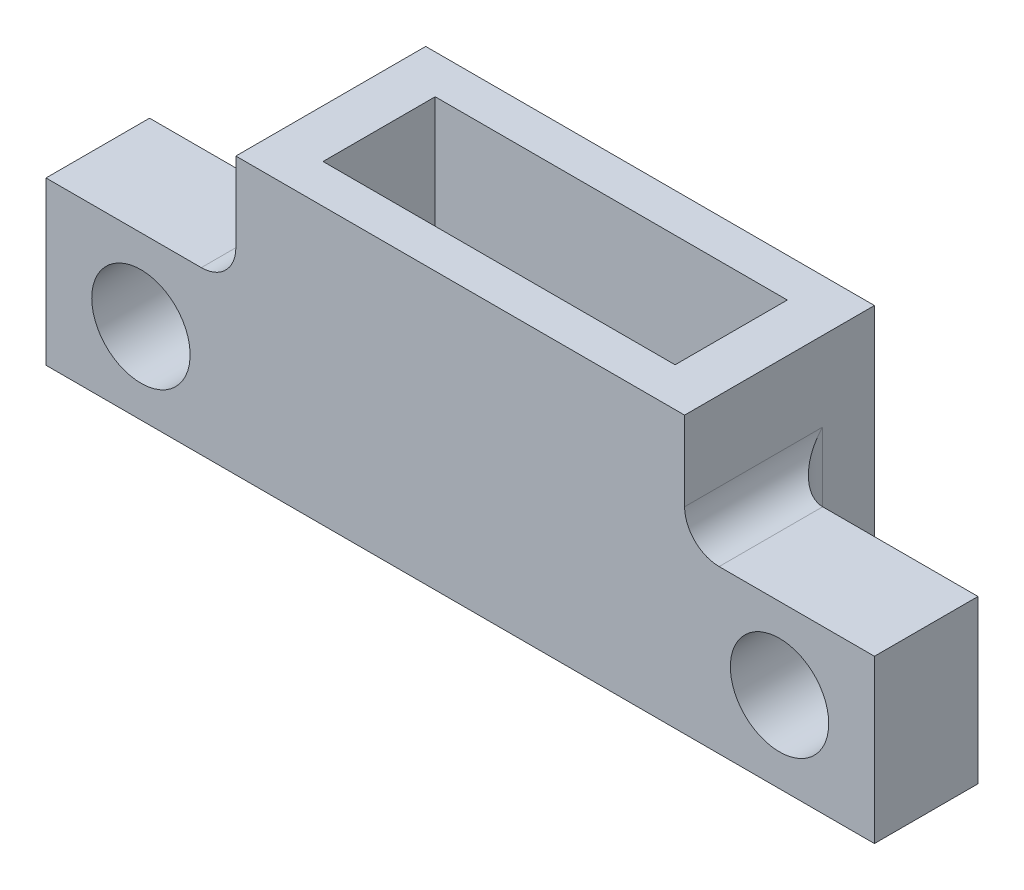
ISO-10303-21;
HEADER;
FILE_DESCRIPTION(('STEP AP214'),'2;1');
FILE_NAME('part.step','',(''),(''),'','','');
FILE_SCHEMA(('AUTOMOTIVE_DESIGN { 1 0 10303 214 1 1 1 1 }'));
ENDSEC;
DATA;
#1=APPLICATION_CONTEXT('core data for automotive mechanical design processes');
#2=APPLICATION_PROTOCOL_DEFINITION('international standard','automotive_design',2000,#1);
#3=PRODUCT_CONTEXT('',#1,'mechanical');
#4=PRODUCT('Part','Part','',(#3));
#5=PRODUCT_RELATED_PRODUCT_CATEGORY('part','',(#4));
#6=PRODUCT_DEFINITION_FORMATION('','',#4);
#7=PRODUCT_DEFINITION_CONTEXT('part definition',#1,'design');
#8=PRODUCT_DEFINITION('design','',#6,#7);
#9=PRODUCT_DEFINITION_SHAPE('','',#8);
#10=(LENGTH_UNIT() NAMED_UNIT(*) SI_UNIT(.MILLI.,.METRE.));
#11=(NAMED_UNIT(*) PLANE_ANGLE_UNIT() SI_UNIT($,.RADIAN.));
#12=(NAMED_UNIT(*) SI_UNIT($,.STERADIAN.) SOLID_ANGLE_UNIT());
#13=UNCERTAINTY_MEASURE_WITH_UNIT(LENGTH_MEASURE(1.E-05),#10,'distance_accuracy_value','');
#14=(GEOMETRIC_REPRESENTATION_CONTEXT(3) GLOBAL_UNCERTAINTY_ASSIGNED_CONTEXT((#13)) GLOBAL_UNIT_ASSIGNED_CONTEXT((#10,
#11,#12)) REPRESENTATION_CONTEXT('',''));
#15=CARTESIAN_POINT('',(0.,0.,0.));
#16=DIRECTION('',(0.,0.,1.));
#17=DIRECTION('',(1.,0.,0.));
#18=AXIS2_PLACEMENT_3D('',#15,#16,#17);
#19=CARTESIAN_POINT('',(13.,10.,5.5));
#20=DIRECTION('',(-1.,0.,0.));
#21=DIRECTION('',(0.,0.,1.));
#22=AXIS2_PLACEMENT_3D('',#19,#20,#21);
#23=PLANE('',#22);
#24=DIRECTION('',(0.,-1.,0.));
#25=VECTOR('',#24,1.);
#26=CARTESIAN_POINT('',(13.,10.,5.5));
#27=LINE('',#26,#25);
#28=CARTESIAN_POINT('',(13.,10.,5.5));
#29=VERTEX_POINT('',#28);
#30=CARTESIAN_POINT('',(13.,5.4,5.5));
#31=VERTEX_POINT('',#30);
#32=EDGE_CURVE('E427',#29,#31,#27,.T.);
#33=ORIENTED_EDGE('',*,*,#32,.T.);
#34=DIRECTION('',(0.,0.,1.));
#35=VECTOR('',#34,1.);
#36=CARTESIAN_POINT('',(13.,5.4,5.5));
#37=LINE('',#36,#35);
#38=CARTESIAN_POINT('',(13.,5.4,-2.5));
#39=VERTEX_POINT('',#38);
#40=EDGE_CURVE('E60',#31,#39,#37,.F.);
#41=ORIENTED_EDGE('',*,*,#40,.T.);
#42=DIRECTION('',(0.,-1.,0.));
#43=VECTOR('',#42,1.);
#44=CARTESIAN_POINT('',(13.,10.,-2.5));
#45=LINE('',#44,#43);
#46=CARTESIAN_POINT('',(13.,-6.,-2.5));
#47=VERTEX_POINT('',#46);
#48=EDGE_CURVE('E448',#39,#47,#45,.T.);
#49=ORIENTED_EDGE('',*,*,#48,.T.);
#50=DIRECTION('',(0.,0.,1.));
#51=VECTOR('',#50,1.);
#52=CARTESIAN_POINT('',(13.,-6.,5.5));
#53=LINE('',#52,#51);
#54=CARTESIAN_POINT('',(13.,-6.,-5.5));
#55=VERTEX_POINT('',#54);
#56=EDGE_CURVE('E242',#55,#47,#53,.T.);
#57=ORIENTED_EDGE('',*,*,#56,.F.);
#58=DIRECTION('',(0.,-1.,0.));
#59=VECTOR('',#58,1.);
#60=CARTESIAN_POINT('',(13.,10.,-5.5));
#61=LINE('',#60,#59);
#62=CARTESIAN_POINT('',(13.,10.,-5.5));
#63=VERTEX_POINT('',#62);
#64=EDGE_CURVE('E434',#63,#55,#61,.T.);
#65=ORIENTED_EDGE('',*,*,#64,.F.);
#66=DIRECTION('',(0.,0.,-1.));
#67=VECTOR('',#66,1.);
#68=CARTESIAN_POINT('',(13.,10.,5.5));
#69=LINE('',#68,#67);
#70=EDGE_CURVE('E418',#29,#63,#69,.T.);
#71=ORIENTED_EDGE('',*,*,#70,.F.);
#72=EDGE_LOOP('',(#33,#41,#49,#57,#65,#71));
#73=FACE_BOUND('',#72,.T.);
#74=ADVANCED_FACE('F37',(#73),#23,.F.);
#75=CARTESIAN_POINT('',(0.,10.,0.));
#76=DIRECTION('',(0.,-1.,0.));
#77=DIRECTION('',(0.,0.,-1.));
#78=AXIS2_PLACEMENT_3D('',#75,#76,#77);
#79=PLANE('',#78);
#80=ORIENTED_EDGE('',*,*,#70,.T.);
#81=DIRECTION('',(-1.,0.,0.));
#82=VECTOR('',#81,1.);
#83=CARTESIAN_POINT('',(-13.,10.,-5.5));
#84=LINE('',#83,#82);
#85=CARTESIAN_POINT('',(-13.,10.,-5.5));
#86=VERTEX_POINT('',#85);
#87=EDGE_CURVE('E421',#63,#86,#84,.T.);
#88=ORIENTED_EDGE('',*,*,#87,.T.);
#89=DIRECTION('',(0.,0.,1.));
#90=VECTOR('',#89,1.);
#91=CARTESIAN_POINT('',(-13.,10.,5.5));
#92=LINE('',#91,#90);
#93=CARTESIAN_POINT('',(-13.,10.,5.5));
#94=VERTEX_POINT('',#93);
#95=EDGE_CURVE('E423',#86,#94,#92,.T.);
#96=ORIENTED_EDGE('',*,*,#95,.T.);
#97=DIRECTION('',(1.,0.,0.));
#98=VECTOR('',#97,1.);
#99=CARTESIAN_POINT('',(-13.,10.,5.5));
#100=LINE('',#99,#98);
#101=EDGE_CURVE('E425',#94,#29,#100,.T.);
#102=ORIENTED_EDGE('',*,*,#101,.T.);
#103=EDGE_LOOP('',(#80,#88,#96,#102));
#104=FACE_BOUND('',#103,.T.);
#105=DIRECTION('',(0.,0.,-1.));
#106=VECTOR('',#105,1.);
#107=CARTESIAN_POINT('',(10.2,10.,3.25));
#108=LINE('',#107,#106);
#109=CARTESIAN_POINT('',(10.2,10.,3.25));
#110=VERTEX_POINT('',#109);
#111=CARTESIAN_POINT('',(10.2,10.,-3.25));
#112=VERTEX_POINT('',#111);
#113=EDGE_CURVE('E385',#110,#112,#108,.T.);
#114=ORIENTED_EDGE('',*,*,#113,.F.);
#115=DIRECTION('',(1.,0.,0.));
#116=VECTOR('',#115,1.);
#117=CARTESIAN_POINT('',(-10.2,10.,3.25));
#118=LINE('',#117,#116);
#119=CARTESIAN_POINT('',(-10.2,10.,3.25));
#120=VERTEX_POINT('',#119);
#121=EDGE_CURVE('E393',#120,#110,#118,.T.);
#122=ORIENTED_EDGE('',*,*,#121,.F.);
#123=DIRECTION('',(0.,0.,1.));
#124=VECTOR('',#123,1.);
#125=CARTESIAN_POINT('',(-10.2,10.,3.25));
#126=LINE('',#125,#124);
#127=CARTESIAN_POINT('',(-10.2,10.,-3.25));
#128=VERTEX_POINT('',#127);
#129=EDGE_CURVE('E390',#128,#120,#126,.T.);
#130=ORIENTED_EDGE('',*,*,#129,.F.);
#131=DIRECTION('',(-1.,0.,0.));
#132=VECTOR('',#131,1.);
#133=CARTESIAN_POINT('',(-10.2,10.,-3.25));
#134=LINE('',#133,#132);
#135=EDGE_CURVE('E387',#112,#128,#134,.T.);
#136=ORIENTED_EDGE('',*,*,#135,.F.);
#137=EDGE_LOOP('',(#114,#122,#130,#136));
#138=FACE_BOUND('',#137,.T.);
#139=ADVANCED_FACE('F480',(#104,#138),#79,.F.);
#140=CARTESIAN_POINT('',(-13.,10.,-5.5));
#141=DIRECTION('',(0.,0.,1.));
#142=DIRECTION('',(1.,0.,0.));
#143=AXIS2_PLACEMENT_3D('',#140,#141,#142);
#144=PLANE('',#143);
#145=ORIENTED_EDGE('',*,*,#64,.T.);
#146=DIRECTION('',(1.,0.,0.));
#147=VECTOR('',#146,1.);
#148=CARTESIAN_POINT('',(-13.,-6.,-5.5));
#149=LINE('',#148,#147);
#150=CARTESIAN_POINT('',(-13.,-6.,-5.5));
#151=VERTEX_POINT('',#150);
#152=EDGE_CURVE('E381',#151,#55,#149,.T.);
#153=ORIENTED_EDGE('',*,*,#152,.F.);
#154=DIRECTION('',(0.,-1.,0.));
#155=VECTOR('',#154,1.);
#156=CARTESIAN_POINT('',(-13.,10.,-5.5));
#157=LINE('',#156,#155);
#158=EDGE_CURVE('E431',#86,#151,#157,.T.);
#159=ORIENTED_EDGE('',*,*,#158,.F.);
#160=ORIENTED_EDGE('',*,*,#87,.F.);
#161=EDGE_LOOP('',(#145,#153,#159,#160));
#162=FACE_BOUND('',#161,.T.);
#163=ADVANCED_FACE('F475',(#162),#144,.F.);
#164=CARTESIAN_POINT('',(-13.,10.,5.5));
#165=DIRECTION('',(1.,0.,0.));
#166=DIRECTION('',(0.,0.,-1.));
#167=AXIS2_PLACEMENT_3D('',#164,#165,#166);
#168=PLANE('',#167);
#169=DIRECTION('',(0.,1.,0.));
#170=VECTOR('',#169,1.);
#171=CARTESIAN_POINT('',(-13.,3.4,-2.5));
#172=LINE('',#171,#170);
#173=CARTESIAN_POINT('',(-13.,-6.,-2.5));
#174=VERTEX_POINT('',#173);
#175=CARTESIAN_POINT('',(-13.,5.4,-2.5));
#176=VERTEX_POINT('',#175);
#177=EDGE_CURVE('E436',#174,#176,#172,.T.);
#178=ORIENTED_EDGE('',*,*,#177,.T.);
#179=DIRECTION('',(0.,0.,1.));
#180=VECTOR('',#179,1.);
#181=CARTESIAN_POINT('',(-13.,5.4,5.5));
#182=LINE('',#181,#180);
#183=CARTESIAN_POINT('',(-13.,5.4,5.5));
#184=VERTEX_POINT('',#183);
#185=EDGE_CURVE('E438',#176,#184,#182,.T.);
#186=ORIENTED_EDGE('',*,*,#185,.T.);
#187=DIRECTION('',(0.,-1.,0.));
#188=VECTOR('',#187,1.);
#189=CARTESIAN_POINT('',(-13.,10.,5.5));
#190=LINE('',#189,#188);
#191=EDGE_CURVE('E429',#94,#184,#190,.T.);
#192=ORIENTED_EDGE('',*,*,#191,.F.);
#193=ORIENTED_EDGE('',*,*,#95,.F.);
#194=ORIENTED_EDGE('',*,*,#158,.T.);
#195=DIRECTION('',(0.,0.,-1.));
#196=VECTOR('',#195,1.);
#197=CARTESIAN_POINT('',(-13.,-6.,5.5));
#198=LINE('',#197,#196);
#199=EDGE_CURVE('E379',#174,#151,#198,.T.);
#200=ORIENTED_EDGE('',*,*,#199,.F.);
#201=EDGE_LOOP('',(#178,#186,#192,#193,#194,#200));
#202=FACE_BOUND('',#201,.T.);
#203=ADVANCED_FACE('F607',(#202),#168,.F.);
#204=CARTESIAN_POINT('',(-13.,10.,5.5));
#205=DIRECTION('',(0.,0.,-1.));
#206=DIRECTION('',(-1.,0.,0.));
#207=AXIS2_PLACEMENT_3D('',#204,#205,#206);
#208=PLANE('',#207);
#209=ORIENTED_EDGE('',*,*,#191,.T.);
#210=CARTESIAN_POINT('',(-15.,5.4,5.5));
#211=DIRECTION('',(0.,0.,-1.));
#212=DIRECTION('',(-1.,0.,0.));
#213=AXIS2_PLACEMENT_3D('',#210,#211,#212);
#214=CIRCLE('',#213,2.);
#215=CARTESIAN_POINT('',(-15.,3.4,5.5));
#216=VERTEX_POINT('',#215);
#217=EDGE_CURVE('E453',#184,#216,#214,.T.);
#218=ORIENTED_EDGE('',*,*,#217,.T.);
#219=DIRECTION('',(-1.,0.,0.));
#220=VECTOR('',#219,1.);
#221=CARTESIAN_POINT('',(-13.,3.4,5.5));
#222=LINE('',#221,#220);
#223=CARTESIAN_POINT('',(-24.,3.4,5.5));
#224=VERTEX_POINT('',#223);
#225=EDGE_CURVE('E259',#216,#224,#222,.T.);
#226=ORIENTED_EDGE('',*,*,#225,.T.);
#227=DIRECTION('',(0.,-1.,0.));
#228=VECTOR('',#227,1.);
#229=CARTESIAN_POINT('',(-24.,-6.,5.5));
#230=LINE('',#229,#228);
#231=CARTESIAN_POINT('',(-24.,-6.,5.5));
#232=VERTEX_POINT('',#231);
#233=EDGE_CURVE('E248',#224,#232,#230,.T.);
#234=ORIENTED_EDGE('',*,*,#233,.T.);
#235=DIRECTION('',(-1.,0.,0.));
#236=VECTOR('',#235,1.);
#237=CARTESIAN_POINT('',(-13.,-6.,5.5));
#238=LINE('',#237,#236);
#239=CARTESIAN_POINT('',(24.,-6.,5.5));
#240=VERTEX_POINT('',#239);
#241=EDGE_CURVE('E228',#240,#232,#238,.T.);
#242=ORIENTED_EDGE('',*,*,#241,.F.);
#243=DIRECTION('',(0.,1.,0.));
#244=VECTOR('',#243,1.);
#245=CARTESIAN_POINT('',(24.,-6.,5.5));
#246=LINE('',#245,#244);
#247=CARTESIAN_POINT('',(24.,3.4,5.5));
#248=VERTEX_POINT('',#247);
#249=EDGE_CURVE('E280',#240,#248,#246,.T.);
#250=ORIENTED_EDGE('',*,*,#249,.T.);
#251=DIRECTION('',(-1.,0.,0.));
#252=VECTOR('',#251,1.);
#253=CARTESIAN_POINT('',(13.,3.4,5.5));
#254=LINE('',#253,#252);
#255=CARTESIAN_POINT('',(15.,3.4,5.5));
#256=VERTEX_POINT('',#255);
#257=EDGE_CURVE('E286',#248,#256,#254,.T.);
#258=ORIENTED_EDGE('',*,*,#257,.T.);
#259=CARTESIAN_POINT('',(15.,5.4,5.5));
#260=DIRECTION('',(0.,0.,-1.));
#261=DIRECTION('',(-1.,0.,0.));
#262=AXIS2_PLACEMENT_3D('',#259,#260,#261);
#263=CIRCLE('',#262,2.);
#264=EDGE_CURVE('E46',#256,#31,#263,.T.);
#265=ORIENTED_EDGE('',*,*,#264,.T.);
#266=ORIENTED_EDGE('',*,*,#32,.F.);
#267=ORIENTED_EDGE('',*,*,#101,.F.);
#268=EDGE_LOOP('',(#209,#218,#226,#234,#242,#250,#258,#265,#266,#267));
#269=FACE_BOUND('',#268,.T.);
#270=CARTESIAN_POINT('',(18.5,-1.3,5.5));
#271=DIRECTION('',(0.,0.,1.));
#272=DIRECTION('',(1.,0.,0.));
#273=AXIS2_PLACEMENT_3D('',#270,#271,#272);
#274=CIRCLE('',#273,2.85);
#275=CARTESIAN_POINT('',(21.35,-1.3,5.5));
#276=VERTEX_POINT('',#275);
#277=EDGE_CURVE('E274',#276,#276,#274,.T.);
#278=ORIENTED_EDGE('',*,*,#277,.F.);
#279=EDGE_LOOP('',(#278));
#280=FACE_BOUND('',#279,.T.);
#281=CARTESIAN_POINT('',(-18.5,-1.3,5.5));
#282=DIRECTION('',(0.,0.,1.));
#283=DIRECTION('',(-1.,0.,0.));
#284=AXIS2_PLACEMENT_3D('',#281,#282,#283);
#285=CIRCLE('',#284,2.85);
#286=CARTESIAN_POINT('',(-21.35,-1.3,5.5));
#287=VERTEX_POINT('',#286);
#288=EDGE_CURVE('E271',#287,#287,#285,.T.);
#289=ORIENTED_EDGE('',*,*,#288,.F.);
#290=EDGE_LOOP('',(#289));
#291=FACE_BOUND('',#290,.T.);
#292=ADVANCED_FACE('F256',(#269,#280,#291),#208,.F.);
#293=CARTESIAN_POINT('',(10.2,10.,3.25));
#294=DIRECTION('',(-1.,0.,0.));
#295=DIRECTION('',(0.,0.,1.));
#296=AXIS2_PLACEMENT_3D('',#293,#294,#295);
#297=PLANE('',#296);
#298=DIRECTION('',(0.,0.,-1.));
#299=VECTOR('',#298,1.);
#300=CARTESIAN_POINT('',(10.2,0.,3.25));
#301=LINE('',#300,#299);
#302=CARTESIAN_POINT('',(10.2,0.,3.25));
#303=VERTEX_POINT('',#302);
#304=CARTESIAN_POINT('',(10.2,0.,-3.25));
#305=VERTEX_POINT('',#304);
#306=EDGE_CURVE('E241',#303,#305,#301,.T.);
#307=ORIENTED_EDGE('',*,*,#306,.F.);
#308=DIRECTION('',(0.,-1.,0.));
#309=VECTOR('',#308,1.);
#310=CARTESIAN_POINT('',(10.2,10.,3.25));
#311=LINE('',#310,#309);
#312=EDGE_CURVE('E395',#110,#303,#311,.T.);
#313=ORIENTED_EDGE('',*,*,#312,.F.);
#314=ORIENTED_EDGE('',*,*,#113,.T.);
#315=DIRECTION('',(0.,-1.,0.));
#316=VECTOR('',#315,1.);
#317=CARTESIAN_POINT('',(10.2,10.,-3.25));
#318=LINE('',#317,#316);
#319=EDGE_CURVE('E415',#112,#305,#318,.T.);
#320=ORIENTED_EDGE('',*,*,#319,.T.);
#321=EDGE_LOOP('',(#307,#313,#314,#320));
#322=FACE_BOUND('',#321,.T.);
#323=ADVANCED_FACE('F606',(#322),#297,.T.);
#324=CARTESIAN_POINT('',(-10.2,10.,-3.25));
#325=DIRECTION('',(0.,0.,1.));
#326=DIRECTION('',(1.,0.,0.));
#327=AXIS2_PLACEMENT_3D('',#324,#325,#326);
#328=PLANE('',#327);
#329=DIRECTION('',(-1.,0.,0.));
#330=VECTOR('',#329,1.);
#331=CARTESIAN_POINT('',(-10.2,0.,-3.25));
#332=LINE('',#331,#330);
#333=CARTESIAN_POINT('',(8.7,0.,-3.25));
#334=VERTEX_POINT('',#333);
#335=EDGE_CURVE('E399',#305,#334,#332,.T.);
#336=ORIENTED_EDGE('',*,*,#335,.F.);
#337=ORIENTED_EDGE('',*,*,#319,.F.);
#338=ORIENTED_EDGE('',*,*,#135,.T.);
#339=DIRECTION('',(0.,-1.,0.));
#340=VECTOR('',#339,1.);
#341=CARTESIAN_POINT('',(-10.2,10.,-3.25));
#342=LINE('',#341,#340);
#343=CARTESIAN_POINT('',(-10.2,0.,-3.25));
#344=VERTEX_POINT('',#343);
#345=EDGE_CURVE('E413',#128,#344,#342,.T.);
#346=ORIENTED_EDGE('',*,*,#345,.T.);
#347=CARTESIAN_POINT('',(-8.7,0.,-3.25));
#348=VERTEX_POINT('',#347);
#349=EDGE_CURVE('E398',#348,#344,#332,.T.);
#350=ORIENTED_EDGE('',*,*,#349,.F.);
#351=DIRECTION('',(0.,1.,0.));
#352=VECTOR('',#351,1.);
#353=CARTESIAN_POINT('',(-8.7,-6.,-3.25));
#354=LINE('',#353,#352);
#355=CARTESIAN_POINT('',(-8.7,-6.,-3.25));
#356=VERTEX_POINT('',#355);
#357=EDGE_CURVE('E376',#356,#348,#354,.T.);
#358=ORIENTED_EDGE('',*,*,#357,.F.);
#359=DIRECTION('',(1.,0.,0.));
#360=VECTOR('',#359,1.);
#361=CARTESIAN_POINT('',(-8.7,-6.,-3.25));
#362=LINE('',#361,#360);
#363=CARTESIAN_POINT('',(-6.2,-6.,-3.25));
#364=VERTEX_POINT('',#363);
#365=EDGE_CURVE('E355',#356,#364,#362,.T.);
#366=ORIENTED_EDGE('',*,*,#365,.T.);
#367=DIRECTION('',(0.,1.,0.));
#368=VECTOR('',#367,1.);
#369=CARTESIAN_POINT('',(-6.2,-6.,-3.25));
#370=LINE('',#369,#368);
#371=CARTESIAN_POINT('',(-6.2,0.,-3.25));
#372=VERTEX_POINT('',#371);
#373=EDGE_CURVE('E373',#364,#372,#370,.T.);
#374=ORIENTED_EDGE('',*,*,#373,.T.);
#375=CARTESIAN_POINT('',(-1.5,0.,-3.25));
#376=VERTEX_POINT('',#375);
#377=EDGE_CURVE('E909',#376,#372,#332,.T.);
#378=ORIENTED_EDGE('',*,*,#377,.F.);
#379=DIRECTION('',(0.,1.,0.));
#380=VECTOR('',#379,1.);
#381=CARTESIAN_POINT('',(-1.5,-6.,-3.25));
#382=LINE('',#381,#380);
#383=CARTESIAN_POINT('',(-1.5,-6.,-3.25));
#384=VERTEX_POINT('',#383);
#385=EDGE_CURVE('E349',#384,#376,#382,.T.);
#386=ORIENTED_EDGE('',*,*,#385,.F.);
#387=DIRECTION('',(1.,0.,0.));
#388=VECTOR('',#387,1.);
#389=CARTESIAN_POINT('',(-1.5,-6.,-3.25));
#390=LINE('',#389,#388);
#391=CARTESIAN_POINT('',(0.999999999999999,-6.,-3.25));
#392=VERTEX_POINT('',#391);
#393=EDGE_CURVE('E328',#384,#392,#390,.T.);
#394=ORIENTED_EDGE('',*,*,#393,.T.);
#395=DIRECTION('',(0.,1.,0.));
#396=VECTOR('',#395,1.);
#397=CARTESIAN_POINT('',(0.999999999999999,-6.,-3.25));
#398=LINE('',#397,#396);
#399=CARTESIAN_POINT('',(0.999999999999997,0.,-3.25));
#400=VERTEX_POINT('',#399);
#401=EDGE_CURVE('E346',#392,#400,#398,.T.);
#402=ORIENTED_EDGE('',*,*,#401,.T.);
#403=CARTESIAN_POINT('',(6.2,0.,-3.25));
#404=VERTEX_POINT('',#403);
#405=EDGE_CURVE('E402',#404,#400,#332,.T.);
#406=ORIENTED_EDGE('',*,*,#405,.F.);
#407=DIRECTION('',(0.,1.,0.));
#408=VECTOR('',#407,1.);
#409=CARTESIAN_POINT('',(6.2,-6.,-3.25));
#410=LINE('',#409,#408);
#411=CARTESIAN_POINT('',(6.2,-6.,-3.25));
#412=VERTEX_POINT('',#411);
#413=EDGE_CURVE('E322',#412,#404,#410,.T.);
#414=ORIENTED_EDGE('',*,*,#413,.F.);
#415=DIRECTION('',(1.,0.,0.));
#416=VECTOR('',#415,1.);
#417=CARTESIAN_POINT('',(6.2,-6.,-3.25));
#418=LINE('',#417,#416);
#419=CARTESIAN_POINT('',(8.7,-6.,-3.25));
#420=VERTEX_POINT('',#419);
#421=EDGE_CURVE('E301',#412,#420,#418,.T.);
#422=ORIENTED_EDGE('',*,*,#421,.T.);
#423=DIRECTION('',(0.,1.,0.));
#424=VECTOR('',#423,1.);
#425=CARTESIAN_POINT('',(8.7,-6.,-3.25));
#426=LINE('',#425,#424);
#427=EDGE_CURVE('E319',#420,#334,#426,.T.);
#428=ORIENTED_EDGE('',*,*,#427,.T.);
#429=EDGE_LOOP('',(#336,#337,#338,#346,#350,#358,#366,#374,#378,#386,#394,#402,#406,#414,#422,#428));
#430=FACE_BOUND('',#429,.T.);
#431=ADVANCED_FACE('F800',(#430),#328,.T.);
#432=CARTESIAN_POINT('',(-10.2,10.,3.25));
#433=DIRECTION('',(1.,0.,0.));
#434=DIRECTION('',(0.,0.,-1.));
#435=AXIS2_PLACEMENT_3D('',#432,#433,#434);
#436=PLANE('',#435);
#437=DIRECTION('',(0.,0.,1.));
#438=VECTOR('',#437,1.);
#439=CARTESIAN_POINT('',(-10.2,0.,3.25));
#440=LINE('',#439,#438);
#441=CARTESIAN_POINT('',(-10.2,0.,3.25));
#442=VERTEX_POINT('',#441);
#443=EDGE_CURVE('E401',#344,#442,#440,.T.);
#444=ORIENTED_EDGE('',*,*,#443,.F.);
#445=ORIENTED_EDGE('',*,*,#345,.F.);
#446=ORIENTED_EDGE('',*,*,#129,.T.);
#447=DIRECTION('',(0.,-1.,0.));
#448=VECTOR('',#447,1.);
#449=CARTESIAN_POINT('',(-10.2,10.,3.25));
#450=LINE('',#449,#448);
#451=EDGE_CURVE('E410',#120,#442,#450,.T.);
#452=ORIENTED_EDGE('',*,*,#451,.T.);
#453=EDGE_LOOP('',(#444,#445,#446,#452));
#454=FACE_BOUND('',#453,.T.);
#455=ADVANCED_FACE('F789',(#454),#436,.T.);
#456=CARTESIAN_POINT('',(-10.2,10.,3.25));
#457=DIRECTION('',(0.,0.,-1.));
#458=DIRECTION('',(-1.,0.,0.));
#459=AXIS2_PLACEMENT_3D('',#456,#457,#458);
#460=PLANE('',#459);
#461=DIRECTION('',(1.,0.,0.));
#462=VECTOR('',#461,1.);
#463=CARTESIAN_POINT('',(-10.2,0.,3.25));
#464=LINE('',#463,#462);
#465=CARTESIAN_POINT('',(-8.7,0.,3.25));
#466=VERTEX_POINT('',#465);
#467=EDGE_CURVE('E388',#442,#466,#464,.T.);
#468=ORIENTED_EDGE('',*,*,#467,.F.);
#469=ORIENTED_EDGE('',*,*,#451,.F.);
#470=ORIENTED_EDGE('',*,*,#121,.T.);
#471=ORIENTED_EDGE('',*,*,#312,.T.);
#472=CARTESIAN_POINT('',(8.7,0.,3.25));
#473=VERTEX_POINT('',#472);
#474=EDGE_CURVE('E405',#473,#303,#464,.T.);
#475=ORIENTED_EDGE('',*,*,#474,.F.);
#476=DIRECTION('',(0.,1.,0.));
#477=VECTOR('',#476,1.);
#478=CARTESIAN_POINT('',(8.7,-6.,3.25));
#479=LINE('',#478,#477);
#480=CARTESIAN_POINT('',(8.7,-6.,3.25));
#481=VERTEX_POINT('',#480);
#482=EDGE_CURVE('E316',#481,#473,#479,.T.);
#483=ORIENTED_EDGE('',*,*,#482,.F.);
#484=DIRECTION('',(-1.,0.,0.));
#485=VECTOR('',#484,1.);
#486=CARTESIAN_POINT('',(6.2,-6.,3.25));
#487=LINE('',#486,#485);
#488=CARTESIAN_POINT('',(6.2,-6.,3.25));
#489=VERTEX_POINT('',#488);
#490=EDGE_CURVE('E307',#481,#489,#487,.T.);
#491=ORIENTED_EDGE('',*,*,#490,.T.);
#492=DIRECTION('',(0.,1.,0.));
#493=VECTOR('',#492,1.);
#494=CARTESIAN_POINT('',(6.2,-6.,3.25));
#495=LINE('',#494,#493);
#496=CARTESIAN_POINT('',(6.2,0.,3.25));
#497=VERTEX_POINT('',#496);
#498=EDGE_CURVE('E309',#489,#497,#495,.T.);
#499=ORIENTED_EDGE('',*,*,#498,.T.);
#500=CARTESIAN_POINT('',(0.999999999999997,0.,3.25));
#501=VERTEX_POINT('',#500);
#502=EDGE_CURVE('E896',#501,#497,#464,.T.);
#503=ORIENTED_EDGE('',*,*,#502,.F.);
#504=DIRECTION('',(0.,1.,0.));
#505=VECTOR('',#504,1.);
#506=CARTESIAN_POINT('',(0.999999999999997,-6.,3.25));
#507=LINE('',#506,#505);
#508=CARTESIAN_POINT('',(0.999999999999997,-6.,3.25));
#509=VERTEX_POINT('',#508);
#510=EDGE_CURVE('E343',#509,#501,#507,.T.);
#511=ORIENTED_EDGE('',*,*,#510,.F.);
#512=DIRECTION('',(-1.,0.,0.));
#513=VECTOR('',#512,1.);
#514=CARTESIAN_POINT('',(-1.5,-6.,3.25));
#515=LINE('',#514,#513);
#516=CARTESIAN_POINT('',(-1.5,-6.,3.25));
#517=VERTEX_POINT('',#516);
#518=EDGE_CURVE('E334',#509,#517,#515,.T.);
#519=ORIENTED_EDGE('',*,*,#518,.T.);
#520=DIRECTION('',(0.,1.,0.));
#521=VECTOR('',#520,1.);
#522=CARTESIAN_POINT('',(-1.5,-6.,3.25));
#523=LINE('',#522,#521);
#524=CARTESIAN_POINT('',(-1.5,0.,3.25));
#525=VERTEX_POINT('',#524);
#526=EDGE_CURVE('E336',#517,#525,#523,.T.);
#527=ORIENTED_EDGE('',*,*,#526,.T.);
#528=CARTESIAN_POINT('',(-6.2,0.,3.25));
#529=VERTEX_POINT('',#528);
#530=EDGE_CURVE('E407',#529,#525,#464,.T.);
#531=ORIENTED_EDGE('',*,*,#530,.F.);
#532=DIRECTION('',(0.,1.,0.));
#533=VECTOR('',#532,1.);
#534=CARTESIAN_POINT('',(-6.2,-6.,3.25));
#535=LINE('',#534,#533);
#536=CARTESIAN_POINT('',(-6.2,-6.,3.25));
#537=VERTEX_POINT('',#536);
#538=EDGE_CURVE('E370',#537,#529,#535,.T.);
#539=ORIENTED_EDGE('',*,*,#538,.F.);
#540=DIRECTION('',(-1.,0.,0.));
#541=VECTOR('',#540,1.);
#542=CARTESIAN_POINT('',(-8.7,-6.,3.25));
#543=LINE('',#542,#541);
#544=CARTESIAN_POINT('',(-8.7,-6.,3.25));
#545=VERTEX_POINT('',#544);
#546=EDGE_CURVE('E361',#537,#545,#543,.T.);
#547=ORIENTED_EDGE('',*,*,#546,.T.);
#548=DIRECTION('',(0.,1.,0.));
#549=VECTOR('',#548,1.);
#550=CARTESIAN_POINT('',(-8.7,-6.,3.25));
#551=LINE('',#550,#549);
#552=EDGE_CURVE('E363',#545,#466,#551,.T.);
#553=ORIENTED_EDGE('',*,*,#552,.T.);
#554=EDGE_LOOP('',(#468,#469,#470,#471,#475,#483,#491,#499,#503,#511,#519,#527,#531,#539,#547,#553));
#555=FACE_BOUND('',#554,.T.);
#556=ADVANCED_FACE('F779',(#555),#460,.T.);
#557=CARTESIAN_POINT('',(0.,0.,0.));
#558=DIRECTION('',(0.,-1.,0.));
#559=DIRECTION('',(0.,0.,-1.));
#560=AXIS2_PLACEMENT_3D('',#557,#558,#559);
#561=PLANE('',#560);
#562=DIRECTION('',(0.,0.,1.));
#563=VECTOR('',#562,1.);
#564=CARTESIAN_POINT('',(-6.2,0.,3.25));
#565=LINE('',#564,#563);
#566=EDGE_CURVE('E356',#372,#529,#565,.T.);
#567=ORIENTED_EDGE('',*,*,#566,.T.);
#568=ORIENTED_EDGE('',*,*,#530,.T.);
#569=DIRECTION('',(0.,0.,-1.));
#570=VECTOR('',#569,1.);
#571=CARTESIAN_POINT('',(-1.5,0.,3.25));
#572=LINE('',#571,#570);
#573=EDGE_CURVE('E325',#525,#376,#572,.T.);
#574=ORIENTED_EDGE('',*,*,#573,.T.);
#575=ORIENTED_EDGE('',*,*,#377,.T.);
#576=EDGE_LOOP('',(#567,#568,#574,#575));
#577=FACE_BOUND('',#576,.T.);
#578=ADVANCED_FACE('F751',(#577),#561,.F.);
#579=DIRECTION('',(0.,0.,1.));
#580=VECTOR('',#579,1.);
#581=CARTESIAN_POINT('',(0.999999999999997,0.,3.25));
#582=LINE('',#581,#580);
#583=EDGE_CURVE('E329',#400,#501,#582,.T.);
#584=ORIENTED_EDGE('',*,*,#583,.T.);
#585=ORIENTED_EDGE('',*,*,#502,.T.);
#586=DIRECTION('',(0.,0.,-1.));
#587=VECTOR('',#586,1.);
#588=CARTESIAN_POINT('',(6.2,0.,3.25));
#589=LINE('',#588,#587);
#590=EDGE_CURVE('E297',#497,#404,#589,.T.);
#591=ORIENTED_EDGE('',*,*,#590,.T.);
#592=ORIENTED_EDGE('',*,*,#405,.T.);
#593=EDGE_LOOP('',(#584,#585,#591,#592));
#594=FACE_BOUND('',#593,.T.);
#595=ADVANCED_FACE('F760',(#594),#561,.F.);
#596=DIRECTION('',(0.,0.,1.));
#597=VECTOR('',#596,1.);
#598=CARTESIAN_POINT('',(8.7,0.,3.25));
#599=LINE('',#598,#597);
#600=EDGE_CURVE('E302',#334,#473,#599,.T.);
#601=ORIENTED_EDGE('',*,*,#600,.T.);
#602=ORIENTED_EDGE('',*,*,#474,.T.);
#603=ORIENTED_EDGE('',*,*,#306,.T.);
#604=ORIENTED_EDGE('',*,*,#335,.T.);
#605=EDGE_LOOP('',(#601,#602,#603,#604));
#606=FACE_BOUND('',#605,.T.);
#607=ADVANCED_FACE('F748',(#606),#561,.F.);
#608=ORIENTED_EDGE('',*,*,#443,.T.);
#609=ORIENTED_EDGE('',*,*,#467,.T.);
#610=DIRECTION('',(0.,0.,-1.));
#611=VECTOR('',#610,1.);
#612=CARTESIAN_POINT('',(-8.7,0.,3.25));
#613=LINE('',#612,#611);
#614=EDGE_CURVE('E352',#466,#348,#613,.T.);
#615=ORIENTED_EDGE('',*,*,#614,.T.);
#616=ORIENTED_EDGE('',*,*,#349,.T.);
#617=EDGE_LOOP('',(#608,#609,#615,#616));
#618=FACE_BOUND('',#617,.T.);
#619=ADVANCED_FACE('F598',(#618),#561,.F.);
#620=CARTESIAN_POINT('',(0.,-6.,0.));
#621=DIRECTION('',(0.,-1.,0.));
#622=DIRECTION('',(0.,0.,-1.));
#623=AXIS2_PLACEMENT_3D('',#620,#621,#622);
#624=PLANE('',#623);
#625=ORIENTED_EDGE('',*,*,#241,.T.);
#626=DIRECTION('',(0.,0.,1.));
#627=VECTOR('',#626,1.);
#628=CARTESIAN_POINT('',(-24.,-6.,-0.5));
#629=LINE('',#628,#627);
#630=CARTESIAN_POINT('',(-24.,-6.,-0.5));
#631=VERTEX_POINT('',#630);
#632=EDGE_CURVE('E233',#631,#232,#629,.T.);
#633=ORIENTED_EDGE('',*,*,#632,.F.);
#634=DIRECTION('',(1.,0.,0.));
#635=VECTOR('',#634,1.);
#636=CARTESIAN_POINT('',(-13.,-6.,-0.5));
#637=LINE('',#636,#635);
#638=CARTESIAN_POINT('',(-15.,-6.,-0.5));
#639=VERTEX_POINT('',#638);
#640=EDGE_CURVE('E268',#631,#639,#637,.T.);
#641=ORIENTED_EDGE('',*,*,#640,.T.);
#642=CARTESIAN_POINT('',(-15.,-6.,-2.5));
#643=DIRECTION('',(0.,-1.,0.));
#644=DIRECTION('',(0.,0.,-1.));
#645=AXIS2_PLACEMENT_3D('',#642,#643,#644);
#646=CIRCLE('',#645,2.);
#647=EDGE_CURVE('E455',#639,#174,#646,.F.);
#648=ORIENTED_EDGE('',*,*,#647,.T.);
#649=ORIENTED_EDGE('',*,*,#199,.T.);
#650=ORIENTED_EDGE('',*,*,#152,.T.);
#651=ORIENTED_EDGE('',*,*,#56,.T.);
#652=CARTESIAN_POINT('',(15.,-6.,-2.5));
#653=DIRECTION('',(0.,-1.,0.));
#654=DIRECTION('',(0.,0.,-1.));
#655=AXIS2_PLACEMENT_3D('',#652,#653,#654);
#656=CIRCLE('',#655,2.);
#657=CARTESIAN_POINT('',(15.,-6.,-0.5));
#658=VERTEX_POINT('',#657);
#659=EDGE_CURVE('E11',#47,#658,#656,.F.);
#660=ORIENTED_EDGE('',*,*,#659,.T.);
#661=DIRECTION('',(1.,0.,0.));
#662=VECTOR('',#661,1.);
#663=CARTESIAN_POINT('',(13.,-6.,-0.5));
#664=LINE('',#663,#662);
#665=CARTESIAN_POINT('',(24.,-6.,-0.5));
#666=VERTEX_POINT('',#665);
#667=EDGE_CURVE('E283',#658,#666,#664,.T.);
#668=ORIENTED_EDGE('',*,*,#667,.T.);
#669=DIRECTION('',(0.,0.,1.));
#670=VECTOR('',#669,1.);
#671=CARTESIAN_POINT('',(24.,-6.,-0.5));
#672=LINE('',#671,#670);
#673=EDGE_CURVE('E236',#666,#240,#672,.T.);
#674=ORIENTED_EDGE('',*,*,#673,.T.);
#675=EDGE_LOOP('',(#625,#633,#641,#648,#649,#650,#651,#660,#668,#674));
#676=FACE_BOUND('',#675,.T.);
#677=ORIENTED_EDGE('',*,*,#365,.F.);
#678=DIRECTION('',(0.,0.,-1.));
#679=VECTOR('',#678,1.);
#680=CARTESIAN_POINT('',(-8.7,-6.,3.25));
#681=LINE('',#680,#679);
#682=EDGE_CURVE('E353',#545,#356,#681,.T.);
#683=ORIENTED_EDGE('',*,*,#682,.F.);
#684=ORIENTED_EDGE('',*,*,#546,.F.);
#685=DIRECTION('',(0.,0.,1.));
#686=VECTOR('',#685,1.);
#687=CARTESIAN_POINT('',(-6.2,-6.,3.25));
#688=LINE('',#687,#686);
#689=EDGE_CURVE('E358',#364,#537,#688,.T.);
#690=ORIENTED_EDGE('',*,*,#689,.F.);
#691=EDGE_LOOP('',(#677,#683,#684,#690));
#692=FACE_BOUND('',#691,.T.);
#693=ORIENTED_EDGE('',*,*,#393,.F.);
#694=DIRECTION('',(0.,0.,-1.));
#695=VECTOR('',#694,1.);
#696=CARTESIAN_POINT('',(-1.5,-6.,3.25));
#697=LINE('',#696,#695);
#698=EDGE_CURVE('E326',#517,#384,#697,.T.);
#699=ORIENTED_EDGE('',*,*,#698,.F.);
#700=ORIENTED_EDGE('',*,*,#518,.F.);
#701=DIRECTION('',(0.,0.,1.));
#702=VECTOR('',#701,1.);
#703=CARTESIAN_POINT('',(0.999999999999997,-6.,3.25));
#704=LINE('',#703,#702);
#705=EDGE_CURVE('E331',#392,#509,#704,.T.);
#706=ORIENTED_EDGE('',*,*,#705,.F.);
#707=EDGE_LOOP('',(#693,#699,#700,#706));
#708=FACE_BOUND('',#707,.T.);
#709=ORIENTED_EDGE('',*,*,#421,.F.);
#710=DIRECTION('',(0.,0.,-1.));
#711=VECTOR('',#710,1.);
#712=CARTESIAN_POINT('',(6.2,-6.,3.25));
#713=LINE('',#712,#711);
#714=EDGE_CURVE('E299',#489,#412,#713,.T.);
#715=ORIENTED_EDGE('',*,*,#714,.F.);
#716=ORIENTED_EDGE('',*,*,#490,.F.);
#717=DIRECTION('',(0.,0.,1.));
#718=VECTOR('',#717,1.);
#719=CARTESIAN_POINT('',(8.7,-6.,3.25));
#720=LINE('',#719,#718);
#721=EDGE_CURVE('E304',#420,#481,#720,.T.);
#722=ORIENTED_EDGE('',*,*,#721,.F.);
#723=EDGE_LOOP('',(#709,#715,#716,#722));
#724=FACE_BOUND('',#723,.T.);
#725=ADVANCED_FACE('F230',(#676,#692,#708,#724),#624,.T.);
#726=CARTESIAN_POINT('',(-8.7,-6.,3.25));
#727=DIRECTION('',(1.,0.,0.));
#728=DIRECTION('',(0.,0.,-1.));
#729=AXIS2_PLACEMENT_3D('',#726,#727,#728);
#730=PLANE('',#729);
#731=ORIENTED_EDGE('',*,*,#614,.F.);
#732=ORIENTED_EDGE('',*,*,#552,.F.);
#733=ORIENTED_EDGE('',*,*,#682,.T.);
#734=ORIENTED_EDGE('',*,*,#357,.T.);
#735=EDGE_LOOP('',(#731,#732,#733,#734));
#736=FACE_BOUND('',#735,.T.);
#737=ADVANCED_FACE('F597',(#736),#730,.T.);
#738=CARTESIAN_POINT('',(-6.2,-6.,3.25));
#739=DIRECTION('',(-1.,0.,0.));
#740=DIRECTION('',(0.,0.,1.));
#741=AXIS2_PLACEMENT_3D('',#738,#739,#740);
#742=PLANE('',#741);
#743=ORIENTED_EDGE('',*,*,#566,.F.);
#744=ORIENTED_EDGE('',*,*,#373,.F.);
#745=ORIENTED_EDGE('',*,*,#689,.T.);
#746=ORIENTED_EDGE('',*,*,#538,.T.);
#747=EDGE_LOOP('',(#743,#744,#745,#746));
#748=FACE_BOUND('',#747,.T.);
#749=ADVANCED_FACE('F718',(#748),#742,.T.);
#750=CARTESIAN_POINT('',(-1.5,-6.,3.25));
#751=DIRECTION('',(1.,0.,0.));
#752=DIRECTION('',(0.,0.,-1.));
#753=AXIS2_PLACEMENT_3D('',#750,#751,#752);
#754=PLANE('',#753);
#755=ORIENTED_EDGE('',*,*,#573,.F.);
#756=ORIENTED_EDGE('',*,*,#526,.F.);
#757=ORIENTED_EDGE('',*,*,#698,.T.);
#758=ORIENTED_EDGE('',*,*,#385,.T.);
#759=EDGE_LOOP('',(#755,#756,#757,#758));
#760=FACE_BOUND('',#759,.T.);
#761=ADVANCED_FACE('F707',(#760),#754,.T.);
#762=CARTESIAN_POINT('',(0.999999999999997,-6.,3.25));
#763=DIRECTION('',(-1.,0.,0.));
#764=DIRECTION('',(0.,0.,1.));
#765=AXIS2_PLACEMENT_3D('',#762,#763,#764);
#766=PLANE('',#765);
#767=ORIENTED_EDGE('',*,*,#583,.F.);
#768=ORIENTED_EDGE('',*,*,#401,.F.);
#769=ORIENTED_EDGE('',*,*,#705,.T.);
#770=ORIENTED_EDGE('',*,*,#510,.T.);
#771=EDGE_LOOP('',(#767,#768,#769,#770));
#772=FACE_BOUND('',#771,.T.);
#773=ADVANCED_FACE('F697',(#772),#766,.T.);
#774=CARTESIAN_POINT('',(6.2,-6.,3.25));
#775=DIRECTION('',(1.,0.,0.));
#776=DIRECTION('',(0.,0.,-1.));
#777=AXIS2_PLACEMENT_3D('',#774,#775,#776);
#778=PLANE('',#777);
#779=ORIENTED_EDGE('',*,*,#590,.F.);
#780=ORIENTED_EDGE('',*,*,#498,.F.);
#781=ORIENTED_EDGE('',*,*,#714,.T.);
#782=ORIENTED_EDGE('',*,*,#413,.T.);
#783=EDGE_LOOP('',(#779,#780,#781,#782));
#784=FACE_BOUND('',#783,.T.);
#785=ADVANCED_FACE('F688',(#784),#778,.T.);
#786=CARTESIAN_POINT('',(8.7,-6.,3.25));
#787=DIRECTION('',(-1.,0.,0.));
#788=DIRECTION('',(0.,0.,1.));
#789=AXIS2_PLACEMENT_3D('',#786,#787,#788);
#790=PLANE('',#789);
#791=ORIENTED_EDGE('',*,*,#600,.F.);
#792=ORIENTED_EDGE('',*,*,#427,.F.);
#793=ORIENTED_EDGE('',*,*,#721,.T.);
#794=ORIENTED_EDGE('',*,*,#482,.T.);
#795=EDGE_LOOP('',(#791,#792,#793,#794));
#796=FACE_BOUND('',#795,.T.);
#797=ADVANCED_FACE('F504',(#796),#790,.T.);
#798=CARTESIAN_POINT('',(13.,3.4,-0.5));
#799=DIRECTION('',(0.,1.,0.));
#800=DIRECTION('',(0.,0.,1.));
#801=AXIS2_PLACEMENT_3D('',#798,#799,#800);
#802=PLANE('',#801);
#803=DIRECTION('',(-1.,0.,0.));
#804=VECTOR('',#803,1.);
#805=CARTESIAN_POINT('',(13.,3.4,-0.5));
#806=LINE('',#805,#804);
#807=CARTESIAN_POINT('',(24.,3.4,-0.5));
#808=VERTEX_POINT('',#807);
#809=CARTESIAN_POINT('',(15.,3.4,-0.5));
#810=VERTEX_POINT('',#809);
#811=EDGE_CURVE('E289',#808,#810,#806,.T.);
#812=ORIENTED_EDGE('',*,*,#811,.T.);
#813=DIRECTION('',(0.,0.,1.));
#814=VECTOR('',#813,1.);
#815=CARTESIAN_POINT('',(15.,3.4,-0.5));
#816=LINE('',#815,#814);
#817=EDGE_CURVE('E445',#810,#256,#816,.T.);
#818=ORIENTED_EDGE('',*,*,#817,.T.);
#819=ORIENTED_EDGE('',*,*,#257,.F.);
#820=DIRECTION('',(0.,0.,1.));
#821=VECTOR('',#820,1.);
#822=CARTESIAN_POINT('',(24.,3.4,-0.5));
#823=LINE('',#822,#821);
#824=EDGE_CURVE('E295',#808,#248,#823,.T.);
#825=ORIENTED_EDGE('',*,*,#824,.F.);
#826=EDGE_LOOP('',(#812,#818,#819,#825));
#827=FACE_BOUND('',#826,.T.);
#828=ADVANCED_FACE('F486',(#827),#802,.T.);
#829=CARTESIAN_POINT('',(24.,-6.,-0.5));
#830=DIRECTION('',(1.,0.,0.));
#831=DIRECTION('',(0.,0.,-1.));
#832=AXIS2_PLACEMENT_3D('',#829,#830,#831);
#833=PLANE('',#832);
#834=ORIENTED_EDGE('',*,*,#249,.F.);
#835=ORIENTED_EDGE('',*,*,#673,.F.);
#836=DIRECTION('',(0.,1.,0.));
#837=VECTOR('',#836,1.);
#838=CARTESIAN_POINT('',(24.,-6.,-0.5));
#839=LINE('',#838,#837);
#840=EDGE_CURVE('E285',#666,#808,#839,.T.);
#841=ORIENTED_EDGE('',*,*,#840,.T.);
#842=ORIENTED_EDGE('',*,*,#824,.T.);
#843=EDGE_LOOP('',(#834,#835,#841,#842));
#844=FACE_BOUND('',#843,.T.);
#845=ADVANCED_FACE('F492',(#844),#833,.T.);
#846=CARTESIAN_POINT('',(0.,0.,-0.5));
#847=DIRECTION('',(0.,0.,-1.));
#848=DIRECTION('',(-1.,0.,0.));
#849=AXIS2_PLACEMENT_3D('',#846,#847,#848);
#850=PLANE('',#849);
#851=CARTESIAN_POINT('',(18.5,-1.3,-0.5));
#852=DIRECTION('',(0.,0.,1.));
#853=DIRECTION('',(1.,0.,0.));
#854=AXIS2_PLACEMENT_3D('',#851,#852,#853);
#855=CIRCLE('',#854,2.85);
#856=CARTESIAN_POINT('',(21.35,-1.3,-0.5));
#857=VERTEX_POINT('',#856);
#858=EDGE_CURVE('E277',#857,#857,#855,.T.);
#859=ORIENTED_EDGE('',*,*,#858,.T.);
#860=EDGE_LOOP('',(#859));
#861=FACE_BOUND('',#860,.T.);
#862=ORIENTED_EDGE('',*,*,#667,.F.);
#863=DIRECTION('',(0.,-1.,0.));
#864=VECTOR('',#863,1.);
#865=CARTESIAN_POINT('',(15.,0.,-0.5));
#866=LINE('',#865,#864);
#867=EDGE_CURVE('E451',#658,#810,#866,.F.);
#868=ORIENTED_EDGE('',*,*,#867,.T.);
#869=ORIENTED_EDGE('',*,*,#811,.F.);
#870=ORIENTED_EDGE('',*,*,#840,.F.);
#871=EDGE_LOOP('',(#862,#868,#869,#870));
#872=FACE_BOUND('',#871,.T.);
#873=ADVANCED_FACE('F490',(#861,#872),#850,.T.);
#874=CARTESIAN_POINT('',(18.5,-1.3,-0.5));
#875=DIRECTION('',(0.,0.,1.));
#876=DIRECTION('',(1.,0.,0.));
#877=AXIS2_PLACEMENT_3D('',#874,#875,#876);
#878=CYLINDRICAL_SURFACE('',#877,2.85);
#879=ORIENTED_EDGE('',*,*,#858,.F.);
#880=EDGE_LOOP('',(#879));
#881=FACE_BOUND('',#880,.T.);
#882=ORIENTED_EDGE('',*,*,#277,.T.);
#883=EDGE_LOOP('',(#882));
#884=FACE_BOUND('',#883,.T.);
#885=ADVANCED_FACE('F500',(#881,#884),#878,.F.);
#886=CARTESIAN_POINT('',(-24.,-6.,-0.5));
#887=DIRECTION('',(-1.,0.,0.));
#888=DIRECTION('',(0.,0.,1.));
#889=AXIS2_PLACEMENT_3D('',#886,#887,#888);
#890=PLANE('',#889);
#891=ORIENTED_EDGE('',*,*,#233,.F.);
#892=DIRECTION('',(0.,0.,1.));
#893=VECTOR('',#892,1.);
#894=CARTESIAN_POINT('',(-24.,3.4,-0.5));
#895=LINE('',#894,#893);
#896=CARTESIAN_POINT('',(-24.,3.4,-0.5));
#897=VERTEX_POINT('',#896);
#898=EDGE_CURVE('E252',#897,#224,#895,.T.);
#899=ORIENTED_EDGE('',*,*,#898,.F.);
#900=DIRECTION('',(0.,-1.,0.));
#901=VECTOR('',#900,1.);
#902=CARTESIAN_POINT('',(-24.,-6.,-0.5));
#903=LINE('',#902,#901);
#904=EDGE_CURVE('E250',#897,#631,#903,.T.);
#905=ORIENTED_EDGE('',*,*,#904,.T.);
#906=ORIENTED_EDGE('',*,*,#632,.T.);
#907=EDGE_LOOP('',(#891,#899,#905,#906));
#908=FACE_BOUND('',#907,.T.);
#909=ADVANCED_FACE('F246',(#908),#890,.T.);
#910=CARTESIAN_POINT('',(-13.,3.4,-0.5));
#911=DIRECTION('',(0.,1.,0.));
#912=DIRECTION('',(0.,0.,1.));
#913=AXIS2_PLACEMENT_3D('',#910,#911,#912);
#914=PLANE('',#913);
#915=ORIENTED_EDGE('',*,*,#225,.F.);
#916=DIRECTION('',(0.,0.,1.));
#917=VECTOR('',#916,1.);
#918=CARTESIAN_POINT('',(-15.,3.4,-0.5));
#919=LINE('',#918,#917);
#920=CARTESIAN_POINT('',(-15.,3.4,-0.5));
#921=VERTEX_POINT('',#920);
#922=EDGE_CURVE('E441',#216,#921,#919,.F.);
#923=ORIENTED_EDGE('',*,*,#922,.T.);
#924=DIRECTION('',(-1.,0.,0.));
#925=VECTOR('',#924,1.);
#926=CARTESIAN_POINT('',(-13.,3.4,-0.5));
#927=LINE('',#926,#925);
#928=EDGE_CURVE('E261',#921,#897,#927,.T.);
#929=ORIENTED_EDGE('',*,*,#928,.T.);
#930=ORIENTED_EDGE('',*,*,#898,.T.);
#931=EDGE_LOOP('',(#915,#923,#929,#930));
#932=FACE_BOUND('',#931,.T.);
#933=ADVANCED_FACE('F554',(#932),#914,.T.);
#934=CARTESIAN_POINT('',(0.,0.,-0.5));
#935=DIRECTION('',(0.,0.,1.));
#936=DIRECTION('',(1.,0.,0.));
#937=AXIS2_PLACEMENT_3D('',#934,#935,#936);
#938=PLANE('',#937);
#939=CARTESIAN_POINT('',(-18.5,-1.3,-0.5));
#940=DIRECTION('',(0.,0.,1.));
#941=DIRECTION('',(-1.,0.,0.));
#942=AXIS2_PLACEMENT_3D('',#939,#940,#941);
#943=CIRCLE('',#942,2.85);
#944=CARTESIAN_POINT('',(-21.35,-1.3,-0.5));
#945=VERTEX_POINT('',#944);
#946=EDGE_CURVE('E263',#945,#945,#943,.T.);
#947=ORIENTED_EDGE('',*,*,#946,.T.);
#948=EDGE_LOOP('',(#947));
#949=FACE_BOUND('',#948,.T.);
#950=ORIENTED_EDGE('',*,*,#928,.F.);
#951=DIRECTION('',(0.,1.,0.));
#952=VECTOR('',#951,1.);
#953=CARTESIAN_POINT('',(-15.,-6.,-0.5));
#954=LINE('',#953,#952);
#955=EDGE_CURVE('E443',#921,#639,#954,.F.);
#956=ORIENTED_EDGE('',*,*,#955,.T.);
#957=ORIENTED_EDGE('',*,*,#640,.F.);
#958=ORIENTED_EDGE('',*,*,#904,.F.);
#959=EDGE_LOOP('',(#950,#956,#957,#958));
#960=FACE_BOUND('',#959,.T.);
#961=ADVANCED_FACE('F545',(#949,#960),#938,.F.);
#962=CARTESIAN_POINT('',(-18.5,-1.3,-0.5));
#963=DIRECTION('',(0.,0.,1.));
#964=DIRECTION('',(1.,0.,0.));
#965=AXIS2_PLACEMENT_3D('',#962,#963,#964);
#966=CYLINDRICAL_SURFACE('',#965,2.85);
#967=ORIENTED_EDGE('',*,*,#946,.F.);
#968=EDGE_LOOP('',(#967));
#969=FACE_BOUND('',#968,.T.);
#970=ORIENTED_EDGE('',*,*,#288,.T.);
#971=EDGE_LOOP('',(#970));
#972=FACE_BOUND('',#971,.T.);
#973=ADVANCED_FACE('F523',(#969,#972),#966,.F.);
#974=CARTESIAN_POINT('',(-15.,10.,-2.5));
#975=DIRECTION('',(0.,-1.,0.));
#976=DIRECTION('',(0.,0.,-1.));
#977=AXIS2_PLACEMENT_3D('',#974,#975,#976);
#978=CYLINDRICAL_SURFACE('',#977,2.);
#979=ORIENTED_EDGE('',*,*,#647,.F.);
#980=ORIENTED_EDGE('',*,*,#955,.F.);
#981=CARTESIAN_POINT('',(-15.,5.4,-2.5));
#982=DIRECTION('',(0.,-0.707106781186547,-0.707106781186547));
#983=DIRECTION('',(0.,-0.707106781186547,0.707106781186547));
#984=AXIS2_PLACEMENT_3D('',#981,#982,#983);
#985=ELLIPSE('',#984,2.82842712474619,2.);
#986=EDGE_CURVE('E253',#176,#921,#985,.T.);
#987=ORIENTED_EDGE('',*,*,#986,.F.);
#988=ORIENTED_EDGE('',*,*,#177,.F.);
#989=EDGE_LOOP('',(#979,#980,#987,#988));
#990=FACE_BOUND('',#989,.T.);
#991=ADVANCED_FACE('F521',(#990),#978,.F.);
#992=CARTESIAN_POINT('',(-15.,5.4,5.5));
#993=DIRECTION('',(0.,0.,1.));
#994=DIRECTION('',(1.,0.,0.));
#995=AXIS2_PLACEMENT_3D('',#992,#993,#994);
#996=CYLINDRICAL_SURFACE('',#995,2.);
#997=ORIENTED_EDGE('',*,*,#986,.T.);
#998=ORIENTED_EDGE('',*,*,#922,.F.);
#999=ORIENTED_EDGE('',*,*,#217,.F.);
#1000=ORIENTED_EDGE('',*,*,#185,.F.);
#1001=EDGE_LOOP('',(#997,#998,#999,#1000));
#1002=FACE_BOUND('',#1001,.T.);
#1003=ADVANCED_FACE('F518',(#1002),#996,.F.);
#1004=CARTESIAN_POINT('',(15.,10.,-2.5));
#1005=DIRECTION('',(0.,-1.,0.));
#1006=DIRECTION('',(0.,0.,-1.));
#1007=AXIS2_PLACEMENT_3D('',#1004,#1005,#1006);
#1008=CYLINDRICAL_SURFACE('',#1007,2.);
#1009=ORIENTED_EDGE('',*,*,#659,.F.);
#1010=ORIENTED_EDGE('',*,*,#48,.F.);
#1011=CARTESIAN_POINT('',(15.,5.4,-2.5));
#1012=DIRECTION('',(0.,-0.707106781186547,-0.707106781186547));
#1013=DIRECTION('',(0.,-0.707106781186547,0.707106781186547));
#1014=AXIS2_PLACEMENT_3D('',#1011,#1012,#1013);
#1015=ELLIPSE('',#1014,2.82842712474619,2.);
#1016=EDGE_CURVE('E41',#810,#39,#1015,.T.);
#1017=ORIENTED_EDGE('',*,*,#1016,.F.);
#1018=ORIENTED_EDGE('',*,*,#867,.F.);
#1019=EDGE_LOOP('',(#1009,#1010,#1017,#1018));
#1020=FACE_BOUND('',#1019,.T.);
#1021=ADVANCED_FACE('F39',(#1020),#1008,.F.);
#1022=CARTESIAN_POINT('',(15.,5.4,-0.5));
#1023=DIRECTION('',(0.,0.,1.));
#1024=DIRECTION('',(1.,0.,0.));
#1025=AXIS2_PLACEMENT_3D('',#1022,#1023,#1024);
#1026=CYLINDRICAL_SURFACE('',#1025,2.);
#1027=ORIENTED_EDGE('',*,*,#1016,.T.);
#1028=ORIENTED_EDGE('',*,*,#40,.F.);
#1029=ORIENTED_EDGE('',*,*,#264,.F.);
#1030=ORIENTED_EDGE('',*,*,#817,.F.);
#1031=EDGE_LOOP('',(#1027,#1028,#1029,#1030));
#1032=FACE_BOUND('',#1031,.T.);
#1033=ADVANCED_FACE('F466',(#1032),#1026,.F.);
#1034=CLOSED_SHELL('',(#74,#139,#163,#203,#292,#323,#431,#455,#556,#578,#595,#607,#619,#725,
#737,#749,#761,#773,#785,#797,#828,#845,#873,#885,#909,#933,#961,#973,#991,#1003,#1021,#1033));
#1035=MANIFOLD_SOLID_BREP('B2',#1034);
#1036=ADVANCED_BREP_SHAPE_REPRESENTATION('',(#18,#1035),#14);
#1037=SHAPE_DEFINITION_REPRESENTATION(#9,#1036);
ENDSEC;
END-ISO-10303-21;
